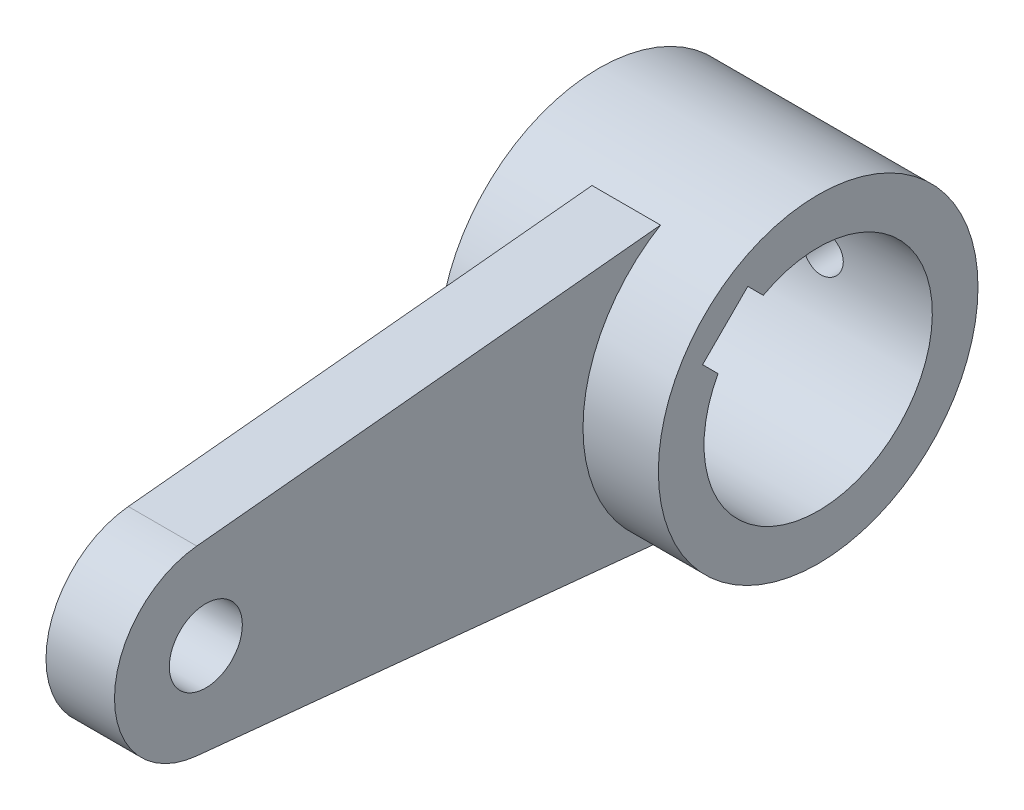
ISO-10303-21;
HEADER;
FILE_DESCRIPTION(('STEP AP214'),'2;1');
FILE_NAME('part.step','',(''),(''),'','','');
FILE_SCHEMA(('AUTOMOTIVE_DESIGN { 1 0 10303 214 1 1 1 1 }'));
ENDSEC;
DATA;
#1=APPLICATION_CONTEXT('core data for automotive mechanical design processes');
#2=APPLICATION_PROTOCOL_DEFINITION('international standard','automotive_design',2000,#1);
#3=PRODUCT_CONTEXT('',#1,'mechanical');
#4=PRODUCT('Part','Part','',(#3));
#5=PRODUCT_RELATED_PRODUCT_CATEGORY('part','',(#4));
#6=PRODUCT_DEFINITION_FORMATION('','',#4);
#7=PRODUCT_DEFINITION_CONTEXT('part definition',#1,'design');
#8=PRODUCT_DEFINITION('design','',#6,#7);
#9=PRODUCT_DEFINITION_SHAPE('','',#8);
#10=(LENGTH_UNIT() NAMED_UNIT(*) SI_UNIT(.MILLI.,.METRE.));
#11=(NAMED_UNIT(*) PLANE_ANGLE_UNIT() SI_UNIT($,.RADIAN.));
#12=(NAMED_UNIT(*) SI_UNIT($,.STERADIAN.) SOLID_ANGLE_UNIT());
#13=UNCERTAINTY_MEASURE_WITH_UNIT(LENGTH_MEASURE(1.E-05),#10,'distance_accuracy_value','');
#14=(GEOMETRIC_REPRESENTATION_CONTEXT(3) GLOBAL_UNCERTAINTY_ASSIGNED_CONTEXT((#13)) GLOBAL_UNIT_ASSIGNED_CONTEXT((#10,
#11,#12)) REPRESENTATION_CONTEXT('',''));
#15=CARTESIAN_POINT('',(0.,0.,0.));
#16=DIRECTION('',(0.,0.,1.));
#17=DIRECTION('',(1.,0.,0.));
#18=AXIS2_PLACEMENT_3D('',#15,#16,#17);
#19=CARTESIAN_POINT('',(24.,0.,0.));
#20=DIRECTION('',(-1.,0.,0.));
#21=DIRECTION('',(0.,0.,1.));
#22=AXIS2_PLACEMENT_3D('',#19,#20,#21);
#23=CYLINDRICAL_SURFACE('',#22,35.);
#24=DIRECTION('',(-1.,0.,0.));
#25=VECTOR('',#24,1.);
#26=CARTESIAN_POINT('',(7.50000000000006,29.9999999999999,18.0277563773202));
#27=LINE('',#26,#25);
#28=CARTESIAN_POINT('',(7.50000000000006,29.9999999999999,18.0277563773202));
#29=VERTEX_POINT('',#28);
#30=CARTESIAN_POINT('',(-7.50000000000006,30.0000000000002,18.0277563773198));
#31=VERTEX_POINT('',#30);
#32=EDGE_CURVE('E63',#29,#31,#27,.T.);
#33=ORIENTED_EDGE('',*,*,#32,.F.);
#34=CARTESIAN_POINT('',(7.50000000000006,0.,0.));
#35=DIRECTION('',(-1.,0.,0.));
#36=DIRECTION('',(0.,0.,-1.));
#37=AXIS2_PLACEMENT_3D('',#34,#35,#36);
#38=CIRCLE('',#37,35.);
#39=CARTESIAN_POINT('',(7.49999999999984,-29.9999999999999,18.0277563773201));
#40=VERTEX_POINT('',#39);
#41=EDGE_CURVE('E145',#40,#29,#38,.T.);
#42=ORIENTED_EDGE('',*,*,#41,.F.);
#43=DIRECTION('',(-1.,0.,0.));
#44=VECTOR('',#43,1.);
#45=CARTESIAN_POINT('',(7.49999999999984,-29.9999999999999,18.02775637732));
#46=LINE('',#45,#44);
#47=CARTESIAN_POINT('',(-7.50000000000006,-30.,18.0277563773201));
#48=VERTEX_POINT('',#47);
#49=EDGE_CURVE('E156',#40,#48,#46,.T.);
#50=ORIENTED_EDGE('',*,*,#49,.T.);
#51=CARTESIAN_POINT('',(-7.50000000000006,0.,0.));
#52=DIRECTION('',(-1.,0.,0.));
#53=DIRECTION('',(0.,0.,-1.));
#54=AXIS2_PLACEMENT_3D('',#51,#52,#53);
#55=CIRCLE('',#54,35.);
#56=EDGE_CURVE('E142',#48,#31,#55,.T.);
#57=ORIENTED_EDGE('',*,*,#56,.T.);
#58=EDGE_LOOP('',(#33,#42,#50,#57));
#59=FACE_BOUND('',#58,.T.);
#60=CARTESIAN_POINT('',(24.,0.,0.));
#61=DIRECTION('',(1.,0.,0.));
#62=DIRECTION('',(0.,0.,-1.));
#63=AXIS2_PLACEMENT_3D('',#60,#61,#62);
#64=CIRCLE('',#63,35.);
#65=CARTESIAN_POINT('',(24.,0.,-35.0000000000001));
#66=VERTEX_POINT('',#65);
#67=EDGE_CURVE('E177',#66,#66,#64,.T.);
#68=ORIENTED_EDGE('',*,*,#67,.F.);
#69=EDGE_LOOP('',(#68));
#70=FACE_BOUND('',#69,.T.);
#71=CARTESIAN_POINT('',(-24.,1.38777878078145E-13,0.));
#72=DIRECTION('',(1.,0.,0.));
#73=DIRECTION('',(0.,0.,-1.));
#74=AXIS2_PLACEMENT_3D('',#71,#72,#73);
#75=CIRCLE('',#74,35.);
#76=CARTESIAN_POINT('',(-24.,1.31006316905768E-13,-35.0000000000002));
#77=VERTEX_POINT('',#76);
#78=EDGE_CURVE('E175',#77,#77,#75,.T.);
#79=ORIENTED_EDGE('',*,*,#78,.T.);
#80=EDGE_LOOP('',(#79));
#81=FACE_BOUND('',#80,.T.);
#82=CARTESIAN_POINT('',(-4.49999999999795,0.,-35.0000000000001));
#83=CARTESIAN_POINT('',(-4.49998934626323,0.25165332787301,-34.9999964079492));
#84=CARTESIAN_POINT('',(-4.47881901313654,0.503462432881622,-34.9972572476564));
#85=CARTESIAN_POINT('',(-4.39470294313489,1.00006950608871,-34.9865936899742));
#86=CARTESIAN_POINT('',(-4.33171397409158,1.2448599448931,-34.978663926651));
#87=CARTESIAN_POINT('',(-4.16585068292526,1.72016871583651,-34.9585122034244));
#88=CARTESIAN_POINT('',(-4.0630036464494,1.95069668671182,-34.9462931803585));
#89=CARTESIAN_POINT('',(-3.82040431243309,2.39117836341598,-34.9189207749941));
#90=CARTESIAN_POINT('',(-3.68065818529077,2.6011355011323,-34.9037678834204));
#91=CARTESIAN_POINT('',(-3.36735984834,2.99577824275652,-34.872120203152));
#92=CARTESIAN_POINT('',(-3.19363599493811,3.18032707080022,-34.8556188598465));
#93=CARTESIAN_POINT('',(-2.81768227222654,3.51773628297913,-34.8231867224519));
#94=CARTESIAN_POINT('',(-2.61545092759334,3.67059502607261,-34.8072559579449));
#95=CARTESIAN_POINT('',(-2.18732976955782,3.94079764224648,-34.7777043595063));
#96=CARTESIAN_POINT('',(-1.96135807855219,4.05801278848392,-34.7640919744397));
#97=CARTESIAN_POINT('',(-1.4927328248932,4.2527787521134,-34.7408052922164));
#98=CARTESIAN_POINT('',(-1.25007993126499,4.33033115918864,-34.7311308372306));
#99=CARTESIAN_POINT('',(-0.756402638542646,4.44315330658755,-34.7168782778969));
#100=CARTESIAN_POINT('',(-0.505431945582919,4.47865446533098,-34.7122722905706));
#101=CARTESIAN_POINT('',(-0.00105596789583604,4.50708256587221,-34.7085929456662));
#102=CARTESIAN_POINT('',(0.252349212981937,4.50001131572939,-34.709519353126));
#103=CARTESIAN_POINT('',(0.752785247515745,4.44368517865488,-34.7167746091793));
#104=CARTESIAN_POINT('',(0.999845376277118,4.39468557875183,-34.7230707625073));
#105=CARTESIAN_POINT('',(1.48220708776198,4.25629214436926,-34.7403050878774));
#106=CARTESIAN_POINT('',(1.71750841953081,4.16689744819153,-34.7512433589438));
#107=CARTESIAN_POINT('',(2.17046410907269,3.94997819255545,-34.7765663978871));
#108=CARTESIAN_POINT('',(2.38806493736931,3.82234306789696,-34.7909611352106));
#109=CARTESIAN_POINT('',(2.79885602982093,3.53264509529871,-34.8215675443459));
#110=CARTESIAN_POINT('',(2.9920451123796,3.37058058189809,-34.837779304035));
#111=CARTESIAN_POINT('',(3.35001026467443,3.01521121875517,-34.8703383270658));
#112=CARTESIAN_POINT('',(3.51456802498406,2.82168639699178,-34.8866857137119));
#113=CARTESIAN_POINT('',(3.80889828104472,2.40964625009437,-34.9175631452333));
#114=CARTESIAN_POINT('',(3.93867068846,2.19113086149998,-34.9320931854935));
#115=CARTESIAN_POINT('',(4.15974809240926,1.73514132152137,-34.9577085505705));
#116=CARTESIAN_POINT('',(4.25103900112687,1.49766026471325,-34.9687926134493));
#117=CARTESIAN_POINT('',(4.39238652013353,1.01056525528189,-34.9862558445041));
#118=CARTESIAN_POINT('',(4.44244517345367,0.760951904454938,-34.9926352457913));
#119=CARTESIAN_POINT('',(4.49962328578115,0.258565063456107,-34.9999399922943));
#120=CARTESIAN_POINT('',(4.50704339651778,0.00582632488202597,-35.0009035246809));
#121=CARTESIAN_POINT('',(4.47952782522867,-0.497291152296168,-34.9973711849402));
#122=CARTESIAN_POINT('',(4.44459309874132,-0.747669944012998,-34.9928754359759));
#123=CARTESIAN_POINT('',(4.33360932491731,-1.23806995443203,-34.978953449007));
#124=CARTESIAN_POINT('',(4.2577040451888,-1.47812424084465,-34.9695444555461));
#125=CARTESIAN_POINT('',(4.06708358974679,-1.94209663413456,-34.9468491097889));
#126=CARTESIAN_POINT('',(3.95236702711763,-2.16601416402027,-34.9335626189332));
#127=CARTESIAN_POINT('',(3.68665590111605,-2.59269685534763,-34.9044977168874));
#128=CARTESIAN_POINT('',(3.53546735311673,-2.79534030307709,-34.8887061410245));
#129=CARTESIAN_POINT('',(3.20137779872869,-3.17248320306642,-34.856437651475));
#130=CARTESIAN_POINT('',(3.01847545768916,-3.34698147026103,-34.8399607089675));
#131=CARTESIAN_POINT('',(2.62482397817469,-3.66395097341672,-34.8080602827339));
#132=CARTESIAN_POINT('',(2.41391347494121,-3.80622260959255,-34.7926437553189));
#133=CARTESIAN_POINT('',(1.9710136659899,-4.05332025045376,-34.7647252726914));
#134=CARTESIAN_POINT('',(1.73902480343794,-4.15814704217679,-34.7522232562218));
#135=CARTESIAN_POINT('',(1.26119114696706,-4.32705800869453,-34.7315971267893));
#136=CARTESIAN_POINT('',(1.01538632145138,-4.39125372534697,-34.7234610377672));
#137=CARTESIAN_POINT('',(0.51637415623198,-4.47743895394315,-34.712453950753));
#138=CARTESIAN_POINT('',(0.263167183153842,-4.49943055265738,-34.709582692443));
#139=CARTESIAN_POINT('',(-0.241475469604263,-4.50054349543313,-34.7094382399852));
#140=CARTESIAN_POINT('',(-0.49291050336614,-4.47997844331802,-34.7121240949414));
#141=CARTESIAN_POINT('',(-0.988718228069382,-4.39722698982339,-34.7227030727448));
#142=CARTESIAN_POINT('',(-1.2330909196428,-4.33504059216886,-34.7305961951259));
#143=CARTESIAN_POINT('',(-1.70778976267144,-4.17091148969119,-34.7506874661817));
#144=CARTESIAN_POINT('',(-1.93812153088474,-4.0689848043739,-34.7628838799904));
#145=CARTESIAN_POINT('',(-2.37846324002884,-3.82829928040348,-34.7902102580458));
#146=CARTESIAN_POINT('',(-2.58847286808703,-3.68953987480967,-34.8053402674465));
#147=CARTESIAN_POINT('',(-2.98381083182192,-3.37796728972694,-34.8369625572439));
#148=CARTESIAN_POINT('',(-3.16895438482854,-3.20492053127973,-34.8534637038449));
#149=CARTESIAN_POINT('',(-3.50769388110499,-2.83017416001703,-34.8858912690295));
#150=CARTESIAN_POINT('',(-3.66128239212762,-2.62846781580994,-34.9018175514874));
#151=CARTESIAN_POINT('',(-3.93308173949073,-2.2011941427817,-34.9313720206136));
#152=CARTESIAN_POINT('',(-4.0511479221065,-1.9755341807514,-34.9449907146482));
#153=CARTESIAN_POINT('',(-4.24753913389305,-1.50753822284372,-34.9682999183415));
#154=CARTESIAN_POINT('',(-4.3259070803965,-1.26522055880229,-34.9779946678445));
#155=CARTESIAN_POINT('',(-4.42204672994264,-0.851391856056574,-34.9900428659326));
#156=CARTESIAN_POINT('',(-4.45123684801209,-0.682483721368774,-34.993758471601));
#157=CARTESIAN_POINT('',(-4.4902170304648,-0.34240775536463,-34.9987382509906));
#158=CARTESIAN_POINT('',(-4.50000724943483,-0.171239942065318,-35.0000024442458));
#159=CARTESIAN_POINT('',(-4.49999999999795,0.,-35.0000000000001));
#160=B_SPLINE_CURVE_WITH_KNOTS('',3,(#82,#83,#84,#85,#86,#87,#88,#89,#90,#91,#92,#93,#94,#95,
#96,#97,#98,#99,#100,#101,#102,#103,#104,#105,#106,#107,#108,#109,#110,#111,#112,#113,#114,#115,
#116,#117,#118,#119,#120,#121,#122,#123,#124,#125,#126,#127,#128,#129,#130,#131,#132,#133,#134,
#135,#136,#137,#138,#139,#140,#141,#142,#143,#144,#145,#146,#147,#148,#149,#150,#151,#152,#153,
#154,#155,#156,#157,#158,#159),.UNSPECIFIED.,.T.,.F.,(4,2,2,2,2,2,2,2,2,2,2,2,2,2,2,2,2,2,2,2,2,
2,2,2,2,2,2,2,2,2,2,2,2,2,2,2,2,2,4),(0.,0.754334466878003,1.50944998270786,2.26404947944349,
3.01852286917709,3.7769109087695,4.53533821098079,5.29647290365006,6.05757708763774,
6.81447297372779,7.57133671451318,8.32362470283764,9.0759287395409,9.83042926827121,
10.584966302946,11.34502593617,12.1050874995113,12.8654270750951,13.6257289740874,
14.3806632115072,15.1355804176911,15.8878656438586,16.6401777556713,17.3965830290764,
18.1530201429504,18.9140214951888,19.675006851314,20.4338939575403,21.1927435398449,
21.9460210087588,22.6992984102569,23.4522724753408,24.2052581311076,24.9635616389121,
25.7220435478204,26.4835735890394,27.2442785819025,27.757576859378,28.2708710466551),.UNSPECIFIED.);
#161=CARTESIAN_POINT('',(-4.49999999999795,0.,-35.0000000000001));
#162=VERTEX_POINT('',#161);
#163=EDGE_CURVE('E129',#162,#162,#160,.T.);
#164=ORIENTED_EDGE('',*,*,#163,.F.);
#165=EDGE_LOOP('',(#164));
#166=FACE_BOUND('',#165,.T.);
#167=ADVANCED_FACE('F34',(#59,#70,#81,#166),#23,.T.);
#168=CARTESIAN_POINT('',(24.,0.,0.));
#169=DIRECTION('',(-1.,0.,0.));
#170=DIRECTION('',(0.,0.,1.));
#171=AXIS2_PLACEMENT_3D('',#168,#169,#170);
#172=CYLINDRICAL_SURFACE('',#171,25.);
#173=DIRECTION('',(-1.,0.,0.));
#174=VECTOR('',#173,1.);
#175=CARTESIAN_POINT('',(24.,12.0208152801716,21.9203102167828));
#176=LINE('',#175,#174);
#177=CARTESIAN_POINT('',(24.,12.0208152801716,21.9203102167828));
#178=VERTEX_POINT('',#177);
#179=CARTESIAN_POINT('',(-24.,12.0208152801714,21.920310216783));
#180=VERTEX_POINT('',#179);
#181=EDGE_CURVE('E11',#178,#180,#176,.T.);
#182=ORIENTED_EDGE('',*,*,#181,.F.);
#183=CARTESIAN_POINT('',(24.,0.,0.));
#184=DIRECTION('',(1.,0.,0.));
#185=DIRECTION('',(0.,0.,-1.));
#186=AXIS2_PLACEMENT_3D('',#183,#184,#185);
#187=CIRCLE('',#186,25.);
#188=CARTESIAN_POINT('',(24.,21.9203102167834,12.020815280171));
#189=VERTEX_POINT('',#188);
#190=EDGE_CURVE('E172',#178,#189,#187,.T.);
#191=ORIENTED_EDGE('',*,*,#190,.T.);
#192=DIRECTION('',(-1.,0.,0.));
#193=VECTOR('',#192,1.);
#194=CARTESIAN_POINT('',(24.,21.9203102167833,12.0208152801712));
#195=LINE('',#194,#193);
#196=CARTESIAN_POINT('',(-24.,21.9203102167831,12.0208152801714));
#197=VERTEX_POINT('',#196);
#198=EDGE_CURVE('E48',#197,#189,#195,.F.);
#199=ORIENTED_EDGE('',*,*,#198,.F.);
#200=CARTESIAN_POINT('',(-24.,1.38777878078145E-13,0.));
#201=DIRECTION('',(1.,0.,0.));
#202=DIRECTION('',(0.,0.,-1.));
#203=AXIS2_PLACEMENT_3D('',#200,#201,#202);
#204=CIRCLE('',#203,25.);
#205=EDGE_CURVE('E123',#180,#197,#204,.T.);
#206=ORIENTED_EDGE('',*,*,#205,.F.);
#207=EDGE_LOOP('',(#182,#191,#199,#206));
#208=FACE_BOUND('',#207,.T.);
#209=CARTESIAN_POINT('',(-4.49999999999862,0.,-25.));
#210=CARTESIAN_POINT('',(-4.49999023794545,0.250597363973776,-24.9999955349824));
#211=CARTESIAN_POINT('',(-4.47899625537798,0.501323876917382,-24.9961930246659));
#212=CARTESIAN_POINT('',(-4.3956219296903,0.995723957330986,-24.9813904308185));
#213=CARTESIAN_POINT('',(-4.33320548999931,1.239391179704,-24.9703840697862));
#214=CARTESIAN_POINT('',(-4.16894916310261,1.71244999616233,-24.9424062116718));
#215=CARTESIAN_POINT('',(-4.06714363575225,1.9418538305926,-24.9254399147402));
#216=CARTESIAN_POINT('',(-3.82709380352837,2.3803001751869,-24.8873996423389));
#217=CARTESIAN_POINT('',(-3.68885289902251,2.58934458292259,-24.8663260502343));
#218=CARTESIAN_POINT('',(-3.37822968752512,2.98347784104035,-24.8221399679868));
#219=CARTESIAN_POINT('',(-3.20552232290177,3.16830850004202,-24.7990093268507));
#220=CARTESIAN_POINT('',(-2.8315681613872,3.50653520488901,-24.7534523836025));
#221=CARTESIAN_POINT('',(-2.63031941200501,3.65992909841614,-24.7310261298052));
#222=CARTESIAN_POINT('',(-2.20318937983305,3.93198738992533,-24.6892410288132));
#223=CARTESIAN_POINT('',(-1.97714004226106,4.05039185622184,-24.6699056064478));
#224=CARTESIAN_POINT('',(-1.50795273724961,4.24744691783923,-24.6367457883014));
#225=CARTESIAN_POINT('',(-1.2648161248963,4.32610066150116,-24.6229209560883));
#226=CARTESIAN_POINT('',(-0.771109385193355,4.44059853206696,-24.6025296249144));
#227=CARTESIAN_POINT('',(-0.520646504029415,4.47689129643564,-24.595887115759));
#228=CARTESIAN_POINT('',(-0.0171050046734566,4.50702896793628,-24.5903830912277));
#229=CARTESIAN_POINT('',(0.235973395787817,4.50087738040693,-24.5915209332983));
#230=CARTESIAN_POINT('',(0.734329570898131,4.44666536597986,-24.6013797705313));
#231=CARTESIAN_POINT('',(0.979664673316051,4.39911277131192,-24.6100088728768));
#232=CARTESIAN_POINT('',(1.45881687055286,4.26424730205578,-24.6337337991101));
#233=CARTESIAN_POINT('',(1.69263351048957,4.17693285860237,-24.648829878161));
#234=CARTESIAN_POINT('',(2.1436102862432,3.96451882360125,-24.6838850704583));
#235=CARTESIAN_POINT('',(2.36067067050966,3.83921201164648,-24.7038707343534));
#236=CARTESIAN_POINT('',(2.77087600628491,3.55451700057607,-24.7464353447752));
#237=CARTESIAN_POINT('',(2.9640187125665,3.39512560565801,-24.7690145343814));
#238=CARTESIAN_POINT('',(3.32384227379379,3.04403715860645,-24.8146237678447));
#239=CARTESIAN_POINT('',(3.49009887265462,2.85190522880332,-24.8376556021255));
#240=CARTESIAN_POINT('',(3.78808180669699,2.44225060557953,-24.881273529755));
#241=CARTESIAN_POINT('',(3.91980784519202,2.22472769402282,-24.9018596020889));
#242=CARTESIAN_POINT('',(4.14504397125807,1.77003953774162,-24.938303265686));
#243=CARTESIAN_POINT('',(4.23851241690934,1.53285322593543,-24.9541556995184));
#244=CARTESIAN_POINT('',(4.38416438602465,1.04579850607948,-24.9793055791381));
#245=CARTESIAN_POINT('',(4.43635194625787,0.795931340606686,-24.9886036658513));
#246=CARTESIAN_POINT('',(4.49737595980609,0.294260216988734,-24.9995098648128));
#247=CARTESIAN_POINT('',(4.50679412041989,0.0425291868628156,-25.0012211575048));
#248=CARTESIAN_POINT('',(4.4835688079446,-0.458911723409051,-24.9970450682725));
#249=CARTESIAN_POINT('',(4.45092723320354,-0.708621694262764,-24.9911580292955));
#250=CARTESIAN_POINT('',(4.34499276666551,-1.19710504925371,-24.9725108511795));
#251=CARTESIAN_POINT('',(4.27199185315796,-1.43594380194746,-24.9598000968949));
#252=CARTESIAN_POINT('',(4.08772514305934,-1.89799257184588,-24.9289247642724));
#253=CARTESIAN_POINT('',(3.9764569105507,-2.12120159304643,-24.910759838757));
#254=CARTESIAN_POINT('',(3.71750990185027,-2.54815393884928,-24.870733959388));
#255=CARTESIAN_POINT('',(3.56947271887275,-2.75167647822345,-24.8488373327331));
#256=CARTESIAN_POINT('',(3.24167799765491,-3.13119917221194,-24.8038743164274));
#257=CARTESIAN_POINT('',(3.06191774493468,-3.30719696915606,-24.7808078267941));
#258=CARTESIAN_POINT('',(2.67315500182862,-3.62886457227498,-24.7357657200145));
#259=CARTESIAN_POINT('',(2.46382297755513,-3.77413883025235,-24.7138068137447));
#260=CARTESIAN_POINT('',(2.02338469814729,-4.02746147197208,-24.6737931763477));
#261=CARTESIAN_POINT('',(1.79227921149239,-4.1355111689035,-24.6557383075042));
#262=CARTESIAN_POINT('',(1.31589632776233,-4.31074517708686,-24.6257060037151));
#263=CARTESIAN_POINT('',(1.07068958451356,-4.37811658335112,-24.6137007869684));
#264=CARTESIAN_POINT('',(0.572202641975165,-4.47066328367746,-24.5970611969284));
#265=CARTESIAN_POINT('',(0.318923277227449,-4.49584292516903,-24.5924260642259));
#266=CARTESIAN_POINT('',(-0.184561947416724,-4.50315482559016,-24.5910878378625));
#267=CARTESIAN_POINT('',(-0.434758663307482,-4.48591048444941,-24.5942698737028));
#268=CARTESIAN_POINT('',(-0.928626221593392,-4.41022247631838,-24.6079538411193));
#269=CARTESIAN_POINT('',(-1.17229709592586,-4.35177901099393,-24.6184557368654));
#270=CARTESIAN_POINT('',(-1.64589578423478,-4.1956059117727,-24.645549491739));
#271=CARTESIAN_POINT('',(-1.87584475423097,-4.0979386489239,-24.6621316787719));
#272=CARTESIAN_POINT('',(-2.31619323333502,-3.8661568748763,-24.69952532906));
#273=CARTESIAN_POINT('',(-2.52659151135086,-3.73204007056213,-24.7203370583836));
#274=CARTESIAN_POINT('',(-2.92499910875446,-3.42897741944,-24.7642042764878));
#275=CARTESIAN_POINT('',(-3.11265894808263,-3.25957598277766,-24.7872867920528));
#276=CARTESIAN_POINT('',(-3.45709859905588,-2.8917072795304,-24.8328876755421));
#277=CARTESIAN_POINT('',(-3.61387129988632,-2.69323333818781,-24.8554059125195));
#278=CARTESIAN_POINT('',(-3.89327881529753,-2.27090824238848,-24.8975568201724));
#279=CARTESIAN_POINT('',(-4.01562311176283,-2.04686231241987,-24.9171643109946));
#280=CARTESIAN_POINT('',(-4.22074281003069,-1.58112288438017,-24.9510392243989));
#281=CARTESIAN_POINT('',(-4.30355622072025,-1.33944659673402,-24.9653117736424));
#282=CARTESIAN_POINT('',(-4.41001277594578,-0.914142661867251,-24.9839218868527));
#283=CARTESIAN_POINT('',(-4.4437016877147,-0.733035393798955,-24.9899178167023));
#284=CARTESIAN_POINT('',(-4.48869863631101,-0.367975256206917,-24.9979584689488));
#285=CARTESIAN_POINT('',(-4.50000716861727,-0.184022449771377,-25.0000032788194));
#286=CARTESIAN_POINT('',(-4.49999999999862,0.,-25.));
#287=B_SPLINE_CURVE_WITH_KNOTS('',3,(#209,#210,#211,#212,#213,#214,#215,#216,#217,#218,#219,
#220,#221,#222,#223,#224,#225,#226,#227,#228,#229,#230,#231,#232,#233,#234,#235,#236,#237,#238,
#239,#240,#241,#242,#243,#244,#245,#246,#247,#248,#249,#250,#251,#252,#253,#254,#255,#256,#257,
#258,#259,#260,#261,#262,#263,#264,#265,#266,#267,#268,#269,#270,#271,#272,#273,#274,#275,#276,
#277,#278,#279,#280,#281,#282,#283,#284,#285,#286),.UNSPECIFIED.,.T.,.F.,(4,2,2,2,2,2,2,2,2,2,2,
2,2,2,2,2,2,2,2,2,2,2,2,2,2,2,2,2,2,2,2,2,2,2,2,2,2,2,4),(0.,0.751119234214503,1.50289387360224,
2.25401419876748,3.00506444969091,3.76356460982688,4.52211668334135,5.28616990310756,
6.05016259876037,6.80598838145,7.56175174373418,8.30837334117038,9.05502440026858,
9.80582347634734,10.5566929789407,11.318448941485,12.0802114488208,12.8428009144684,
13.605315798907,14.3574280220777,15.1095063001762,15.8562135718348,16.602968384167,
17.357309381147,18.1117149569093,18.8753101422363,19.6388783870833,20.3989073934044,
21.158858081699,21.9077085429221,22.6565553386182,23.4042160535912,24.1519238163252,
24.9099617237495,25.6681739427101,26.4326044530471,27.1962984766996,27.7478839346363,
28.2994571808941),.UNSPECIFIED.);
#288=CARTESIAN_POINT('',(-4.49999999999862,0.,-25.));
#289=VERTEX_POINT('',#288);
#290=EDGE_CURVE('E38',#289,#289,#287,.T.);
#291=ORIENTED_EDGE('',*,*,#290,.T.);
#292=EDGE_LOOP('',(#291));
#293=FACE_BOUND('',#292,.T.);
#294=ADVANCED_FACE('F189',(#208,#293),#172,.F.);
#295=CARTESIAN_POINT('',(24.,0.,0.));
#296=DIRECTION('',(1.,0.,0.));
#297=DIRECTION('',(0.,0.,-1.));
#298=AXIS2_PLACEMENT_3D('',#295,#296,#297);
#299=PLANE('',#298);
#300=DIRECTION('',(0.,-0.707106781186551,-0.707106781186548));
#301=VECTOR('',#300,1.);
#302=CARTESIAN_POINT('',(24.,-6.19663877508586,3.7028561615258));
#303=LINE('',#302,#301);
#304=CARTESIAN_POINT('',(24.,15.4149278298671,25.3144227664783));
#305=VERTEX_POINT('',#304);
#306=EDGE_CURVE('E124',#305,#178,#303,.T.);
#307=ORIENTED_EDGE('',*,*,#306,.F.);
#308=DIRECTION('',(0.,-0.707106781186548,0.707106781186551));
#309=VECTOR('',#308,1.);
#310=CARTESIAN_POINT('',(24.,25.3144227664787,15.4149278298667));
#311=LINE('',#310,#309);
#312=CARTESIAN_POINT('',(24.,25.3144227664787,15.4149278298667));
#313=VERTEX_POINT('',#312);
#314=EDGE_CURVE('E126',#313,#305,#311,.T.);
#315=ORIENTED_EDGE('',*,*,#314,.F.);
#316=DIRECTION('',(0.,0.707106781186551,0.707106781186548));
#317=VECTOR('',#316,1.);
#318=CARTESIAN_POINT('',(24.,3.70285616152571,-6.19663877508597));
#319=LINE('',#318,#317);
#320=EDGE_CURVE('E106',#189,#313,#319,.T.);
#321=ORIENTED_EDGE('',*,*,#320,.F.);
#322=ORIENTED_EDGE('',*,*,#190,.F.);
#323=EDGE_LOOP('',(#307,#315,#321,#322));
#324=FACE_BOUND('',#323,.T.);
#325=ORIENTED_EDGE('',*,*,#67,.T.);
#326=EDGE_LOOP('',(#325));
#327=FACE_BOUND('',#326,.T.);
#328=ADVANCED_FACE('F186',(#324,#327),#299,.T.);
#329=CARTESIAN_POINT('',(-24.,1.38777878078145E-13,0.));
#330=DIRECTION('',(1.,0.,0.));
#331=DIRECTION('',(0.,0.,-1.));
#332=AXIS2_PLACEMENT_3D('',#329,#330,#331);
#333=PLANE('',#332);
#334=ORIENTED_EDGE('',*,*,#78,.F.);
#335=EDGE_LOOP('',(#334));
#336=FACE_BOUND('',#335,.T.);
#337=DIRECTION('',(0.,-0.707106781186548,0.707106781186551));
#338=VECTOR('',#337,1.);
#339=CARTESIAN_POINT('',(-24.,25.3144227664784,15.4149278298668));
#340=LINE('',#339,#338);
#341=CARTESIAN_POINT('',(-24.,25.3144227664784,15.4149278298668));
#342=VERTEX_POINT('',#341);
#343=CARTESIAN_POINT('',(-24.,15.4149278298672,25.3144227664784));
#344=VERTEX_POINT('',#343);
#345=EDGE_CURVE('E114',#342,#344,#340,.T.);
#346=ORIENTED_EDGE('',*,*,#345,.T.);
#347=DIRECTION('',(0.,-0.707106781186551,-0.707106781186548));
#348=VECTOR('',#347,1.);
#349=CARTESIAN_POINT('',(-24.,-6.19663877508589,3.70285616152563));
#350=LINE('',#349,#348);
#351=EDGE_CURVE('E111',#344,#180,#350,.T.);
#352=ORIENTED_EDGE('',*,*,#351,.T.);
#353=ORIENTED_EDGE('',*,*,#205,.T.);
#354=DIRECTION('',(0.,0.707106781186551,0.707106781186548));
#355=VECTOR('',#354,1.);
#356=CARTESIAN_POINT('',(-24.,3.7028561615258,-6.19663877508594));
#357=LINE('',#356,#355);
#358=EDGE_CURVE('E55',#197,#342,#357,.T.);
#359=ORIENTED_EDGE('',*,*,#358,.T.);
#360=EDGE_LOOP('',(#346,#352,#353,#359));
#361=FACE_BOUND('',#360,.T.);
#362=ADVANCED_FACE('F121',(#336,#361),#333,.F.);
#363=CARTESIAN_POINT('',(7.50000000000006,29.9999999999999,18.0277563773202));
#364=DIRECTION('',(0.,-0.995092310823555,-0.0989509622987184));
#365=DIRECTION('',(0.,0.0989509622987184,-0.995092310823555));
#366=AXIS2_PLACEMENT_3D('',#363,#364,#365);
#367=PLANE('',#366);
#368=DIRECTION('',(0.,-0.0989509622987184,0.995092310823555));
#369=VECTOR('',#368,1.);
#370=CARTESIAN_POINT('',(-7.50000000000006,30.0000000000002,18.0277563773198));
#371=LINE('',#370,#369);
#372=CARTESIAN_POINT('',(-7.4999999999974,19.9018462164711,119.579019245974));
#373=VERTEX_POINT('',#372);
#374=EDGE_CURVE('E158',#31,#373,#371,.T.);
#375=ORIENTED_EDGE('',*,*,#374,.T.);
#376=DIRECTION('',(-1.,0.,0.));
#377=VECTOR('',#376,1.);
#378=CARTESIAN_POINT('',(7.5000000000025,19.9018462164706,119.579019245975));
#379=LINE('',#378,#377);
#380=CARTESIAN_POINT('',(7.5000000000025,19.9018462164706,119.579019245975));
#381=VERTEX_POINT('',#380);
#382=EDGE_CURVE('E168',#381,#373,#379,.T.);
#383=ORIENTED_EDGE('',*,*,#382,.F.);
#384=DIRECTION('',(0.,-0.0989509622987184,0.995092310823555));
#385=VECTOR('',#384,1.);
#386=CARTESIAN_POINT('',(7.50000000000006,29.9999999999999,18.0277563773202));
#387=LINE('',#386,#385);
#388=EDGE_CURVE('E148',#29,#381,#387,.T.);
#389=ORIENTED_EDGE('',*,*,#388,.F.);
#390=ORIENTED_EDGE('',*,*,#32,.T.);
#391=EDGE_LOOP('',(#375,#383,#389,#390));
#392=FACE_BOUND('',#391,.T.);
#393=ADVANCED_FACE('F244',(#392),#367,.F.);
#394=CARTESIAN_POINT('',(7.5000000000025,-2.22044604925031E-13,117.6));
#395=DIRECTION('',(-1.,0.,0.));
#396=DIRECTION('',(0.,0.,1.));
#397=AXIS2_PLACEMENT_3D('',#394,#395,#396);
#398=CYLINDRICAL_SURFACE('',#397,20.);
#399=CARTESIAN_POINT('',(-7.4999999999974,1.11022302462516E-13,117.6));
#400=DIRECTION('',(1.,0.,0.));
#401=DIRECTION('',(0.,0.,-1.));
#402=AXIS2_PLACEMENT_3D('',#399,#400,#401);
#403=CIRCLE('',#402,20.);
#404=CARTESIAN_POINT('',(-7.49999999999984,-19.9018462164712,119.579019245975));
#405=VERTEX_POINT('',#404);
#406=EDGE_CURVE('E160',#373,#405,#403,.T.);
#407=ORIENTED_EDGE('',*,*,#406,.T.);
#408=DIRECTION('',(-1.,0.,0.));
#409=VECTOR('',#408,1.);
#410=CARTESIAN_POINT('',(7.50000000000006,-19.9018462164713,119.579019245975));
#411=LINE('',#410,#409);
#412=CARTESIAN_POINT('',(7.50000000000006,-19.9018462164713,119.579019245975));
#413=VERTEX_POINT('',#412);
#414=EDGE_CURVE('E165',#413,#405,#411,.T.);
#415=ORIENTED_EDGE('',*,*,#414,.F.);
#416=CARTESIAN_POINT('',(7.5000000000025,-2.22044604925031E-13,117.6));
#417=DIRECTION('',(1.,0.,0.));
#418=DIRECTION('',(0.,0.,-1.));
#419=AXIS2_PLACEMENT_3D('',#416,#417,#418);
#420=CIRCLE('',#419,20.);
#421=EDGE_CURVE('E151',#381,#413,#420,.T.);
#422=ORIENTED_EDGE('',*,*,#421,.F.);
#423=ORIENTED_EDGE('',*,*,#382,.T.);
#424=EDGE_LOOP('',(#407,#415,#422,#423));
#425=FACE_BOUND('',#424,.T.);
#426=ADVANCED_FACE('F240',(#425),#398,.T.);
#427=CARTESIAN_POINT('',(7.50000000000006,-19.9018462164712,119.579019245975));
#428=DIRECTION('',(0.,0.995092310823555,-0.0989509622987184));
#429=DIRECTION('',(0.,0.0989509622987184,0.995092310823555));
#430=AXIS2_PLACEMENT_3D('',#427,#428,#429);
#431=PLANE('',#430);
#432=DIRECTION('',(0.,-0.0989509622987184,-0.995092310823555));
#433=VECTOR('',#432,1.);
#434=CARTESIAN_POINT('',(-7.49999999999984,-19.9018462164712,119.579019245975));
#435=LINE('',#434,#433);
#436=EDGE_CURVE('E149',#405,#48,#435,.T.);
#437=ORIENTED_EDGE('',*,*,#436,.T.);
#438=ORIENTED_EDGE('',*,*,#49,.F.);
#439=DIRECTION('',(0.,-0.0989509622987184,-0.995092310823555));
#440=VECTOR('',#439,1.);
#441=CARTESIAN_POINT('',(7.50000000000006,-19.9018462164712,119.579019245975));
#442=LINE('',#441,#440);
#443=EDGE_CURVE('E153',#413,#40,#442,.T.);
#444=ORIENTED_EDGE('',*,*,#443,.F.);
#445=ORIENTED_EDGE('',*,*,#414,.T.);
#446=EDGE_LOOP('',(#437,#438,#444,#445));
#447=FACE_BOUND('',#446,.T.);
#448=ADVANCED_FACE('F233',(#447),#431,.F.);
#449=CARTESIAN_POINT('',(7.50000000000006,0.,0.));
#450=DIRECTION('',(1.,0.,0.));
#451=DIRECTION('',(0.,0.,-1.));
#452=AXIS2_PLACEMENT_3D('',#449,#450,#451);
#453=PLANE('',#452);
#454=CARTESIAN_POINT('',(7.5000000000025,-2.22044604925031E-13,117.6));
#455=DIRECTION('',(1.,0.,0.));
#456=DIRECTION('',(0.,0.,-1.));
#457=AXIS2_PLACEMENT_3D('',#454,#455,#456);
#458=CIRCLE('',#457,8.);
#459=CARTESIAN_POINT('',(7.5000000000025,-2.23820961764432E-13,109.6));
#460=VERTEX_POINT('',#459);
#461=EDGE_CURVE('E137',#460,#460,#458,.T.);
#462=ORIENTED_EDGE('',*,*,#461,.F.);
#463=EDGE_LOOP('',(#462));
#464=FACE_BOUND('',#463,.T.);
#465=ORIENTED_EDGE('',*,*,#41,.T.);
#466=ORIENTED_EDGE('',*,*,#388,.T.);
#467=ORIENTED_EDGE('',*,*,#421,.T.);
#468=ORIENTED_EDGE('',*,*,#443,.T.);
#469=EDGE_LOOP('',(#465,#466,#467,#468));
#470=FACE_BOUND('',#469,.T.);
#471=ADVANCED_FACE('F230',(#464,#470),#453,.T.);
#472=CARTESIAN_POINT('',(-7.50000000000006,0.,0.));
#473=DIRECTION('',(1.,0.,0.));
#474=DIRECTION('',(0.,0.,-1.));
#475=AXIS2_PLACEMENT_3D('',#472,#473,#474);
#476=PLANE('',#475);
#477=CARTESIAN_POINT('',(-7.4999999999974,1.11022302462516E-13,117.6));
#478=DIRECTION('',(1.,0.,0.));
#479=DIRECTION('',(0.,0.,-1.));
#480=AXIS2_PLACEMENT_3D('',#477,#478,#479);
#481=CIRCLE('',#480,8.);
#482=CARTESIAN_POINT('',(-7.4999999999974,1.09245945623115E-13,109.6));
#483=VERTEX_POINT('',#482);
#484=EDGE_CURVE('E139',#483,#483,#481,.T.);
#485=ORIENTED_EDGE('',*,*,#484,.T.);
#486=EDGE_LOOP('',(#485));
#487=FACE_BOUND('',#486,.T.);
#488=ORIENTED_EDGE('',*,*,#56,.F.);
#489=ORIENTED_EDGE('',*,*,#436,.F.);
#490=ORIENTED_EDGE('',*,*,#406,.F.);
#491=ORIENTED_EDGE('',*,*,#374,.F.);
#492=EDGE_LOOP('',(#488,#489,#490,#491));
#493=FACE_BOUND('',#492,.T.);
#494=ADVANCED_FACE('F201',(#487,#493),#476,.F.);
#495=CARTESIAN_POINT('',(-7.4999999999974,1.11022302462516E-13,117.6));
#496=DIRECTION('',(1.,0.,0.));
#497=DIRECTION('',(0.,0.,-1.));
#498=AXIS2_PLACEMENT_3D('',#495,#496,#497);
#499=CYLINDRICAL_SURFACE('',#498,8.);
#500=ORIENTED_EDGE('',*,*,#484,.F.);
#501=EDGE_LOOP('',(#500));
#502=FACE_BOUND('',#501,.T.);
#503=ORIENTED_EDGE('',*,*,#461,.T.);
#504=EDGE_LOOP('',(#503));
#505=FACE_BOUND('',#504,.T.);
#506=ADVANCED_FACE('F194',(#502,#505),#499,.F.);
#507=CARTESIAN_POINT('',(-24.,-6.19663877508589,3.70285616152563));
#508=DIRECTION('',(0.,-0.707106781186548,0.707106781186551));
#509=DIRECTION('',(0.,-0.707106781186551,-0.707106781186548));
#510=AXIS2_PLACEMENT_3D('',#507,#508,#509);
#511=PLANE('',#510);
#512=ORIENTED_EDGE('',*,*,#181,.T.);
#513=ORIENTED_EDGE('',*,*,#351,.F.);
#514=DIRECTION('',(1.,0.,0.));
#515=VECTOR('',#514,1.);
#516=CARTESIAN_POINT('',(-24.,15.4149278298672,25.3144227664784));
#517=LINE('',#516,#515);
#518=EDGE_CURVE('E110',#344,#305,#517,.T.);
#519=ORIENTED_EDGE('',*,*,#518,.T.);
#520=ORIENTED_EDGE('',*,*,#306,.T.);
#521=EDGE_LOOP('',(#512,#513,#519,#520));
#522=FACE_BOUND('',#521,.T.);
#523=ADVANCED_FACE('F192',(#522),#511,.F.);
#524=CARTESIAN_POINT('',(-24.,25.3144227664784,15.4149278298668));
#525=DIRECTION('',(0.,0.70710678118655,0.707106781186548));
#526=DIRECTION('',(0.,-0.707106781186548,0.707106781186551));
#527=AXIS2_PLACEMENT_3D('',#524,#525,#526);
#528=PLANE('',#527);
#529=ORIENTED_EDGE('',*,*,#314,.T.);
#530=ORIENTED_EDGE('',*,*,#518,.F.);
#531=ORIENTED_EDGE('',*,*,#345,.F.);
#532=DIRECTION('',(1.,0.,0.));
#533=VECTOR('',#532,1.);
#534=CARTESIAN_POINT('',(-24.,25.3144227664784,15.4149278298668));
#535=LINE('',#534,#533);
#536=EDGE_CURVE('E102',#342,#313,#535,.T.);
#537=ORIENTED_EDGE('',*,*,#536,.T.);
#538=EDGE_LOOP('',(#529,#530,#531,#537));
#539=FACE_BOUND('',#538,.T.);
#540=ADVANCED_FACE('F115',(#539),#528,.F.);
#541=CARTESIAN_POINT('',(-24.,3.7028561615258,-6.19663877508594));
#542=DIRECTION('',(0.,0.707106781186548,-0.707106781186551));
#543=DIRECTION('',(0.,0.707106781186551,0.707106781186548));
#544=AXIS2_PLACEMENT_3D('',#541,#542,#543);
#545=PLANE('',#544);
#546=ORIENTED_EDGE('',*,*,#198,.T.);
#547=ORIENTED_EDGE('',*,*,#320,.T.);
#548=ORIENTED_EDGE('',*,*,#536,.F.);
#549=ORIENTED_EDGE('',*,*,#358,.F.);
#550=EDGE_LOOP('',(#546,#547,#548,#549));
#551=FACE_BOUND('',#550,.T.);
#552=ADVANCED_FACE('F104',(#551),#545,.F.);
#553=CARTESIAN_POINT('',(0.,0.,-11.));
#554=DIRECTION('',(0.,0.,-1.));
#555=DIRECTION('',(-1.,0.,0.));
#556=AXIS2_PLACEMENT_3D('',#553,#554,#555);
#557=CYLINDRICAL_SURFACE('',#556,4.5);
#558=ORIENTED_EDGE('',*,*,#290,.F.);
#559=EDGE_LOOP('',(#558));
#560=FACE_BOUND('',#559,.T.);
#561=ORIENTED_EDGE('',*,*,#163,.T.);
#562=EDGE_LOOP('',(#561));
#563=FACE_BOUND('',#562,.T.);
#564=ADVANCED_FACE('F219',(#560,#563),#557,.F.);
#565=CLOSED_SHELL('',(#167,#294,#328,#362,#393,#426,#448,#471,#494,#506,#523,#540,#552,#564));
#566=MANIFOLD_SOLID_BREP('B2',#565);
#567=ADVANCED_BREP_SHAPE_REPRESENTATION('',(#18,#566),#14);
#568=SHAPE_DEFINITION_REPRESENTATION(#9,#567);
ENDSEC;
END-ISO-10303-21;
